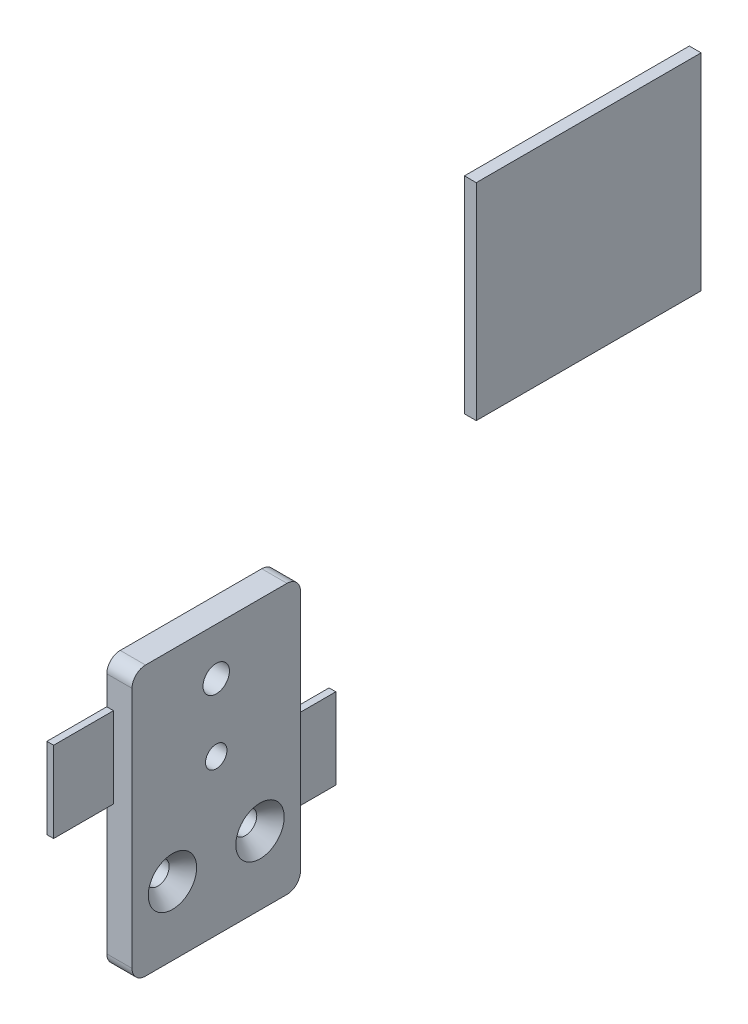
ISO-10303-21;
HEADER;
FILE_DESCRIPTION(('STEP AP214'),'2;1');
FILE_NAME('part.step','',(''),(''),'','','');
FILE_SCHEMA(('AUTOMOTIVE_DESIGN { 1 0 10303 214 1 1 1 1 }'));
ENDSEC;
DATA;
#1=APPLICATION_CONTEXT('core data for automotive mechanical design processes');
#2=APPLICATION_PROTOCOL_DEFINITION('international standard','automotive_design',2000,#1);
#3=PRODUCT_CONTEXT('',#1,'mechanical');
#4=PRODUCT('Part','Part','',(#3));
#5=PRODUCT_RELATED_PRODUCT_CATEGORY('part','',(#4));
#6=PRODUCT_DEFINITION_FORMATION('','',#4);
#7=PRODUCT_DEFINITION_CONTEXT('part definition',#1,'design');
#8=PRODUCT_DEFINITION('design','',#6,#7);
#9=PRODUCT_DEFINITION_SHAPE('','',#8);
#10=(LENGTH_UNIT() NAMED_UNIT(*) SI_UNIT(.MILLI.,.METRE.));
#11=(NAMED_UNIT(*) PLANE_ANGLE_UNIT() SI_UNIT($,.RADIAN.));
#12=(NAMED_UNIT(*) SI_UNIT($,.STERADIAN.) SOLID_ANGLE_UNIT());
#13=UNCERTAINTY_MEASURE_WITH_UNIT(LENGTH_MEASURE(1.E-05),#10,'distance_accuracy_value','');
#14=(GEOMETRIC_REPRESENTATION_CONTEXT(3) GLOBAL_UNCERTAINTY_ASSIGNED_CONTEXT((#13)) GLOBAL_UNIT_ASSIGNED_CONTEXT((#10,
#11,#12)) REPRESENTATION_CONTEXT('',''));
#15=CARTESIAN_POINT('',(0.,0.,0.));
#16=DIRECTION('',(0.,0.,1.));
#17=DIRECTION('',(1.,0.,0.));
#18=AXIS2_PLACEMENT_3D('',#15,#16,#17);
#19=CARTESIAN_POINT('',(2.54,0.,0.));
#20=DIRECTION('',(-1.,0.,0.));
#21=DIRECTION('',(0.,0.,1.));
#22=AXIS2_PLACEMENT_3D('',#19,#20,#21);
#23=PLANE('',#22);
#24=DIRECTION('',(0.,-1.,0.));
#25=VECTOR('',#24,1.);
#26=CARTESIAN_POINT('',(2.54,72.9724571619236,-49.0162949771469));
#27=LINE('',#26,#25);
#28=CARTESIAN_POINT('',(2.54,72.9724571619236,-49.0162949771469));
#29=VERTEX_POINT('',#28);
#30=CARTESIAN_POINT('',(2.54,34.112691774636,-49.0162949771469));
#31=VERTEX_POINT('',#30);
#32=EDGE_CURVE('E56',#29,#31,#27,.T.);
#33=ORIENTED_EDGE('',*,*,#32,.F.);
#34=DIRECTION('',(0.,0.,1.));
#35=VECTOR('',#34,1.);
#36=CARTESIAN_POINT('',(2.54,72.9724571619236,-49.0162949771469));
#37=LINE('',#36,#35);
#38=CARTESIAN_POINT('',(2.54,72.9724571619236,-91.4087663087333));
#39=VERTEX_POINT('',#38);
#40=EDGE_CURVE('E79',#39,#29,#37,.T.);
#41=ORIENTED_EDGE('',*,*,#40,.F.);
#42=DIRECTION('',(0.,1.,0.));
#43=VECTOR('',#42,1.);
#44=CARTESIAN_POINT('',(2.54,72.9724571619236,-91.4087663087333));
#45=LINE('',#44,#43);
#46=CARTESIAN_POINT('',(2.54,34.112691774636,-91.4087663087333));
#47=VERTEX_POINT('',#46);
#48=EDGE_CURVE('E84',#47,#39,#45,.T.);
#49=ORIENTED_EDGE('',*,*,#48,.F.);
#50=DIRECTION('',(0.,0.,-1.));
#51=VECTOR('',#50,1.);
#52=CARTESIAN_POINT('',(2.54,34.112691774636,-49.0162949771469));
#53=LINE('',#52,#51);
#54=EDGE_CURVE('E99',#31,#47,#53,.T.);
#55=ORIENTED_EDGE('',*,*,#54,.F.);
#56=EDGE_LOOP('',(#33,#41,#49,#55));
#57=FACE_BOUND('',#56,.T.);
#58=ADVANCED_FACE('F48',(#57),#23,.T.);
#59=CARTESIAN_POINT('',(4.7625,0.,0.));
#60=DIRECTION('',(1.,0.,0.));
#61=DIRECTION('',(0.,0.,-1.));
#62=AXIS2_PLACEMENT_3D('',#59,#60,#61);
#63=PLANE('',#62);
#64=DIRECTION('',(0.,-1.,0.));
#65=VECTOR('',#64,1.);
#66=CARTESIAN_POINT('',(4.7625,72.9724571619236,-49.0162949771469));
#67=LINE('',#66,#65);
#68=CARTESIAN_POINT('',(4.7625,72.9724571619236,-49.0162949771469));
#69=VERTEX_POINT('',#68);
#70=CARTESIAN_POINT('',(4.7625,34.112691774636,-49.0162949771469));
#71=VERTEX_POINT('',#70);
#72=EDGE_CURVE('E108',#69,#71,#67,.T.);
#73=ORIENTED_EDGE('',*,*,#72,.T.);
#74=DIRECTION('',(0.,0.,-1.));
#75=VECTOR('',#74,1.);
#76=CARTESIAN_POINT('',(4.7625,34.112691774636,-49.0162949771469));
#77=LINE('',#76,#75);
#78=CARTESIAN_POINT('',(4.7625,34.112691774636,-91.4087663087333));
#79=VERTEX_POINT('',#78);
#80=EDGE_CURVE('E97',#71,#79,#77,.T.);
#81=ORIENTED_EDGE('',*,*,#80,.T.);
#82=DIRECTION('',(0.,1.,0.));
#83=VECTOR('',#82,1.);
#84=CARTESIAN_POINT('',(4.7625,72.9724571619236,-91.4087663087333));
#85=LINE('',#84,#83);
#86=CARTESIAN_POINT('',(4.7625,72.9724571619236,-91.4087663087333));
#87=VERTEX_POINT('',#86);
#88=EDGE_CURVE('E100',#79,#87,#85,.T.);
#89=ORIENTED_EDGE('',*,*,#88,.T.);
#90=DIRECTION('',(0.,0.,1.));
#91=VECTOR('',#90,1.);
#92=CARTESIAN_POINT('',(4.7625,72.9724571619236,-49.0162949771469));
#93=LINE('',#92,#91);
#94=EDGE_CURVE('E105',#87,#69,#93,.T.);
#95=ORIENTED_EDGE('',*,*,#94,.T.);
#96=EDGE_LOOP('',(#73,#81,#89,#95));
#97=FACE_BOUND('',#96,.T.);
#98=ADVANCED_FACE('F107',(#97),#63,.T.);
#99=CARTESIAN_POINT('',(-57.5082862860164,34.112691774636,-49.0162949771469));
#100=DIRECTION('',(0.,-1.,0.));
#101=DIRECTION('',(0.,0.,-1.));
#102=AXIS2_PLACEMENT_3D('',#99,#100,#101);
#103=PLANE('',#102);
#104=DIRECTION('',(1.,0.,0.));
#105=VECTOR('',#104,1.);
#106=CARTESIAN_POINT('',(-57.5082862860164,34.112691774636,-49.0162949771469));
#107=LINE('',#106,#105);
#108=EDGE_CURVE('E12',#31,#71,#107,.T.);
#109=ORIENTED_EDGE('',*,*,#108,.F.);
#110=ORIENTED_EDGE('',*,*,#54,.T.);
#111=DIRECTION('',(1.,0.,0.));
#112=VECTOR('',#111,1.);
#113=CARTESIAN_POINT('',(-57.5082862860164,34.112691774636,-91.4087663087333));
#114=LINE('',#113,#112);
#115=EDGE_CURVE('E94',#47,#79,#114,.T.);
#116=ORIENTED_EDGE('',*,*,#115,.T.);
#117=ORIENTED_EDGE('',*,*,#80,.F.);
#118=EDGE_LOOP('',(#109,#110,#116,#117));
#119=FACE_BOUND('',#118,.T.);
#120=ADVANCED_FACE('F95',(#119),#103,.T.);
#121=CARTESIAN_POINT('',(-57.5082862860164,72.9724571619236,-91.4087663087333));
#122=DIRECTION('',(0.,0.,-1.));
#123=DIRECTION('',(-1.,0.,0.));
#124=AXIS2_PLACEMENT_3D('',#121,#122,#123);
#125=PLANE('',#124);
#126=ORIENTED_EDGE('',*,*,#115,.F.);
#127=ORIENTED_EDGE('',*,*,#48,.T.);
#128=DIRECTION('',(1.,0.,0.));
#129=VECTOR('',#128,1.);
#130=CARTESIAN_POINT('',(-57.5082862860164,72.9724571619236,-91.4087663087333));
#131=LINE('',#130,#129);
#132=EDGE_CURVE('E89',#39,#87,#131,.T.);
#133=ORIENTED_EDGE('',*,*,#132,.T.);
#134=ORIENTED_EDGE('',*,*,#88,.F.);
#135=EDGE_LOOP('',(#126,#127,#133,#134));
#136=FACE_BOUND('',#135,.T.);
#137=ADVANCED_FACE('F101',(#136),#125,.T.);
#138=CARTESIAN_POINT('',(-57.5082862860164,72.9724571619236,-49.0162949771469));
#139=DIRECTION('',(0.,1.,0.));
#140=DIRECTION('',(0.,0.,1.));
#141=AXIS2_PLACEMENT_3D('',#138,#139,#140);
#142=PLANE('',#141);
#143=ORIENTED_EDGE('',*,*,#132,.F.);
#144=ORIENTED_EDGE('',*,*,#40,.T.);
#145=DIRECTION('',(1.,0.,0.));
#146=VECTOR('',#145,1.);
#147=CARTESIAN_POINT('',(-57.5082862860164,72.9724571619236,-49.0162949771469));
#148=LINE('',#147,#146);
#149=EDGE_CURVE('E115',#29,#69,#148,.T.);
#150=ORIENTED_EDGE('',*,*,#149,.T.);
#151=ORIENTED_EDGE('',*,*,#94,.F.);
#152=EDGE_LOOP('',(#143,#144,#150,#151));
#153=FACE_BOUND('',#152,.T.);
#154=ADVANCED_FACE('F121',(#153),#142,.T.);
#155=CARTESIAN_POINT('',(-57.5082862860164,72.9724571619236,-49.0162949771469));
#156=DIRECTION('',(0.,0.,1.));
#157=DIRECTION('',(1.,0.,0.));
#158=AXIS2_PLACEMENT_3D('',#155,#156,#157);
#159=PLANE('',#158);
#160=ORIENTED_EDGE('',*,*,#149,.F.);
#161=ORIENTED_EDGE('',*,*,#32,.T.);
#162=ORIENTED_EDGE('',*,*,#108,.T.);
#163=ORIENTED_EDGE('',*,*,#72,.F.);
#164=EDGE_LOOP('',(#160,#161,#162,#163));
#165=FACE_BOUND('',#164,.T.);
#166=ADVANCED_FACE('F122',(#165),#159,.T.);
#167=CLOSED_SHELL('',(#58,#98,#120,#137,#154,#166));
#168=MANIFOLD_SOLID_BREP('B2',#167);
#169=CARTESIAN_POINT('',(4.7625,-25.4,-15.875));
#170=DIRECTION('',(0.,0.,1.));
#171=DIRECTION('',(0.,-1.,0.));
#172=AXIS2_PLACEMENT_3D('',#169,#170,#171);
#173=PLANE('',#172);
#174=DIRECTION('',(0.,1.,0.));
#175=VECTOR('',#174,1.);
#176=CARTESIAN_POINT('',(0.,-25.4,-15.875));
#177=LINE('',#176,#175);
#178=CARTESIAN_POINT('',(0.,-22.86,-15.875));
#179=VERTEX_POINT('',#178);
#180=CARTESIAN_POINT('',(0.,-15.6404812704776,-15.875));
#181=VERTEX_POINT('',#180);
#182=EDGE_CURVE('E318',#179,#181,#177,.T.);
#183=ORIENTED_EDGE('',*,*,#182,.T.);
#184=DIRECTION('',(-1.,0.,0.));
#185=VECTOR('',#184,1.);
#186=CARTESIAN_POINT('',(1.27,-15.6404812704776,-15.875));
#187=LINE('',#186,#185);
#188=CARTESIAN_POINT('',(1.27,-15.6404812704776,-15.875));
#189=VERTEX_POINT('',#188);
#190=EDGE_CURVE('E194',#189,#181,#187,.T.);
#191=ORIENTED_EDGE('',*,*,#190,.F.);
#192=DIRECTION('',(0.,1.,0.));
#193=VECTOR('',#192,1.);
#194=CARTESIAN_POINT('',(1.27,-0.400481270477608,-15.875));
#195=LINE('',#194,#193);
#196=CARTESIAN_POINT('',(1.27,-0.40048127047761,-15.875));
#197=VERTEX_POINT('',#196);
#198=EDGE_CURVE('E189',#189,#197,#195,.T.);
#199=ORIENTED_EDGE('',*,*,#198,.T.);
#200=DIRECTION('',(-1.,0.,0.));
#201=VECTOR('',#200,1.);
#202=CARTESIAN_POINT('',(1.27,-0.400481270477608,-15.875));
#203=LINE('',#202,#201);
#204=CARTESIAN_POINT('',(0.,-0.400481270477608,-15.875));
#205=VERTEX_POINT('',#204);
#206=EDGE_CURVE('E297',#197,#205,#203,.T.);
#207=ORIENTED_EDGE('',*,*,#206,.T.);
#208=CARTESIAN_POINT('',(0.,22.86,-15.875));
#209=VERTEX_POINT('',#208);
#210=EDGE_CURVE('E322',#205,#209,#177,.T.);
#211=ORIENTED_EDGE('',*,*,#210,.T.);
#212=DIRECTION('',(-1.,0.,0.));
#213=VECTOR('',#212,1.);
#214=CARTESIAN_POINT('',(4.7625,22.86,-15.875));
#215=LINE('',#214,#213);
#216=CARTESIAN_POINT('',(4.7625,22.86,-15.875));
#217=VERTEX_POINT('',#216);
#218=EDGE_CURVE('E353',#209,#217,#215,.F.);
#219=ORIENTED_EDGE('',*,*,#218,.T.);
#220=DIRECTION('',(0.,1.,0.));
#221=VECTOR('',#220,1.);
#222=CARTESIAN_POINT('',(4.7625,-25.4,-15.875));
#223=LINE('',#222,#221);
#224=CARTESIAN_POINT('',(4.7625,-22.86,-15.875));
#225=VERTEX_POINT('',#224);
#226=EDGE_CURVE('E334',#225,#217,#223,.T.);
#227=ORIENTED_EDGE('',*,*,#226,.F.);
#228=DIRECTION('',(-1.,0.,0.));
#229=VECTOR('',#228,1.);
#230=CARTESIAN_POINT('',(4.7625,-22.86,-15.875));
#231=LINE('',#230,#229);
#232=EDGE_CURVE('E350',#225,#179,#231,.T.);
#233=ORIENTED_EDGE('',*,*,#232,.T.);
#234=EDGE_LOOP('',(#183,#191,#199,#207,#211,#219,#227,#233));
#235=FACE_BOUND('',#234,.T.);
#236=ADVANCED_FACE('F174',(#235),#173,.F.);
#237=CARTESIAN_POINT('',(4.7625,25.4,15.875));
#238=DIRECTION('',(0.,-1.,0.));
#239=DIRECTION('',(0.,0.,-1.));
#240=AXIS2_PLACEMENT_3D('',#237,#238,#239);
#241=PLANE('',#240);
#242=DIRECTION('',(0.,0.,1.));
#243=VECTOR('',#242,1.);
#244=CARTESIAN_POINT('',(4.7625,25.4,15.875));
#245=LINE('',#244,#243);
#246=CARTESIAN_POINT('',(4.7625,25.4,-13.335));
#247=VERTEX_POINT('',#246);
#248=CARTESIAN_POINT('',(4.7625,25.4,13.335));
#249=VERTEX_POINT('',#248);
#250=EDGE_CURVE('E445',#247,#249,#245,.T.);
#251=ORIENTED_EDGE('',*,*,#250,.F.);
#252=DIRECTION('',(-1.,0.,0.));
#253=VECTOR('',#252,1.);
#254=CARTESIAN_POINT('',(4.7625,25.4,-13.335));
#255=LINE('',#254,#253);
#256=CARTESIAN_POINT('',(0.,25.4,-13.335));
#257=VERTEX_POINT('',#256);
#258=EDGE_CURVE('E337',#247,#257,#255,.T.);
#259=ORIENTED_EDGE('',*,*,#258,.T.);
#260=DIRECTION('',(0.,0.,1.));
#261=VECTOR('',#260,1.);
#262=CARTESIAN_POINT('',(0.,25.4,15.875));
#263=LINE('',#262,#261);
#264=CARTESIAN_POINT('',(0.,25.4,13.335));
#265=VERTEX_POINT('',#264);
#266=EDGE_CURVE('E321',#257,#265,#263,.T.);
#267=ORIENTED_EDGE('',*,*,#266,.T.);
#268=DIRECTION('',(-1.,0.,0.));
#269=VECTOR('',#268,1.);
#270=CARTESIAN_POINT('',(4.7625,25.4,13.335));
#271=LINE('',#270,#269);
#272=EDGE_CURVE('E335',#265,#249,#271,.F.);
#273=ORIENTED_EDGE('',*,*,#272,.T.);
#274=EDGE_LOOP('',(#251,#259,#267,#273));
#275=FACE_BOUND('',#274,.T.);
#276=ADVANCED_FACE('F459',(#275),#241,.F.);
#277=CARTESIAN_POINT('',(4.7625,-25.4,15.875));
#278=DIRECTION('',(0.,0.,-1.));
#279=DIRECTION('',(0.,1.,0.));
#280=AXIS2_PLACEMENT_3D('',#277,#278,#279);
#281=PLANE('',#280);
#282=DIRECTION('',(0.,-1.,0.));
#283=VECTOR('',#282,1.);
#284=CARTESIAN_POINT('',(0.,-25.4,15.875));
#285=LINE('',#284,#283);
#286=CARTESIAN_POINT('',(0.,22.86,15.875));
#287=VERTEX_POINT('',#286);
#288=CARTESIAN_POINT('',(0.,17.4719887939091,15.875));
#289=VERTEX_POINT('',#288);
#290=EDGE_CURVE('E329',#287,#289,#285,.T.);
#291=ORIENTED_EDGE('',*,*,#290,.T.);
#292=DIRECTION('',(-1.,0.,0.));
#293=VECTOR('',#292,1.);
#294=CARTESIAN_POINT('',(1.27,17.4719887939091,15.875));
#295=LINE('',#294,#293);
#296=CARTESIAN_POINT('',(1.27,17.4719887939091,15.875));
#297=VERTEX_POINT('',#296);
#298=EDGE_CURVE('E397',#297,#289,#295,.T.);
#299=ORIENTED_EDGE('',*,*,#298,.F.);
#300=DIRECTION('',(0.,-1.,0.));
#301=VECTOR('',#300,1.);
#302=CARTESIAN_POINT('',(1.27,17.4719887939091,15.875));
#303=LINE('',#302,#301);
#304=CARTESIAN_POINT('',(1.27,2.23198879390913,15.875));
#305=VERTEX_POINT('',#304);
#306=EDGE_CURVE('E389',#297,#305,#303,.T.);
#307=ORIENTED_EDGE('',*,*,#306,.T.);
#308=DIRECTION('',(-1.,0.,0.));
#309=VECTOR('',#308,1.);
#310=CARTESIAN_POINT('',(1.27,2.23198879390913,15.875));
#311=LINE('',#310,#309);
#312=CARTESIAN_POINT('',(0.,2.23198879390913,15.875));
#313=VERTEX_POINT('',#312);
#314=EDGE_CURVE('E404',#305,#313,#311,.T.);
#315=ORIENTED_EDGE('',*,*,#314,.T.);
#316=CARTESIAN_POINT('',(0.,-22.86,15.875));
#317=VERTEX_POINT('',#316);
#318=EDGE_CURVE('E328',#313,#317,#285,.T.);
#319=ORIENTED_EDGE('',*,*,#318,.T.);
#320=DIRECTION('',(-1.,0.,0.));
#321=VECTOR('',#320,1.);
#322=CARTESIAN_POINT('',(4.7625,-22.86,15.875));
#323=LINE('',#322,#321);
#324=CARTESIAN_POINT('',(4.7625,-22.86,15.875));
#325=VERTEX_POINT('',#324);
#326=EDGE_CURVE('E46',#317,#325,#323,.F.);
#327=ORIENTED_EDGE('',*,*,#326,.T.);
#328=DIRECTION('',(0.,-1.,0.));
#329=VECTOR('',#328,1.);
#330=CARTESIAN_POINT('',(4.7625,-25.4,15.875));
#331=LINE('',#330,#329);
#332=CARTESIAN_POINT('',(4.7625,22.86,15.875));
#333=VERTEX_POINT('',#332);
#334=EDGE_CURVE('E375',#333,#325,#331,.T.);
#335=ORIENTED_EDGE('',*,*,#334,.F.);
#336=DIRECTION('',(-1.,0.,0.));
#337=VECTOR('',#336,1.);
#338=CARTESIAN_POINT('',(4.7625,22.86,15.875));
#339=LINE('',#338,#337);
#340=EDGE_CURVE('E182',#333,#287,#339,.T.);
#341=ORIENTED_EDGE('',*,*,#340,.T.);
#342=EDGE_LOOP('',(#291,#299,#307,#315,#319,#327,#335,#341));
#343=FACE_BOUND('',#342,.T.);
#344=ADVANCED_FACE('F372',(#343),#281,.F.);
#345=CARTESIAN_POINT('',(4.7625,-25.4,15.875));
#346=DIRECTION('',(0.,1.,0.));
#347=DIRECTION('',(0.,0.,1.));
#348=AXIS2_PLACEMENT_3D('',#345,#346,#347);
#349=PLANE('',#348);
#350=DIRECTION('',(0.,0.,-1.));
#351=VECTOR('',#350,1.);
#352=CARTESIAN_POINT('',(0.,-25.4,15.875));
#353=LINE('',#352,#351);
#354=CARTESIAN_POINT('',(0.,-25.4,13.335));
#355=VERTEX_POINT('',#354);
#356=CARTESIAN_POINT('',(0.,-25.4,-13.335));
#357=VERTEX_POINT('',#356);
#358=EDGE_CURVE('E331',#355,#357,#353,.T.);
#359=ORIENTED_EDGE('',*,*,#358,.T.);
#360=DIRECTION('',(-1.,0.,0.));
#361=VECTOR('',#360,1.);
#362=CARTESIAN_POINT('',(4.7625,-25.4,-13.335));
#363=LINE('',#362,#361);
#364=CARTESIAN_POINT('',(4.7625,-25.4,-13.335));
#365=VERTEX_POINT('',#364);
#366=EDGE_CURVE('E366',#357,#365,#363,.F.);
#367=ORIENTED_EDGE('',*,*,#366,.T.);
#368=DIRECTION('',(0.,0.,-1.));
#369=VECTOR('',#368,1.);
#370=CARTESIAN_POINT('',(4.7625,-25.4,15.875));
#371=LINE('',#370,#369);
#372=CARTESIAN_POINT('',(4.7625,-25.4,13.335));
#373=VERTEX_POINT('',#372);
#374=EDGE_CURVE('E323',#373,#365,#371,.T.);
#375=ORIENTED_EDGE('',*,*,#374,.F.);
#376=DIRECTION('',(-1.,0.,0.));
#377=VECTOR('',#376,1.);
#378=CARTESIAN_POINT('',(4.7625,-25.4,13.335));
#379=LINE('',#378,#377);
#380=EDGE_CURVE('E363',#373,#355,#379,.T.);
#381=ORIENTED_EDGE('',*,*,#380,.T.);
#382=EDGE_LOOP('',(#359,#367,#375,#381));
#383=FACE_BOUND('',#382,.T.);
#384=ADVANCED_FACE('F507',(#383),#349,.F.);
#385=CARTESIAN_POINT('',(4.7625,0.,0.));
#386=DIRECTION('',(-1.,0.,0.));
#387=DIRECTION('',(0.,0.,1.));
#388=AXIS2_PLACEMENT_3D('',#385,#386,#387);
#389=PLANE('',#388);
#390=CARTESIAN_POINT('',(4.7625,3.81,0.));
#391=DIRECTION('',(1.,0.,0.));
#392=DIRECTION('',(0.,0.,-1.));
#393=AXIS2_PLACEMENT_3D('',#390,#391,#392);
#394=CIRCLE('',#393,2.0193);
#395=CARTESIAN_POINT('',(4.7625,3.81,-2.0193));
#396=VERTEX_POINT('',#395);
#397=EDGE_CURVE('E399',#396,#396,#394,.T.);
#398=ORIENTED_EDGE('',*,*,#397,.F.);
#399=EDGE_LOOP('',(#398));
#400=FACE_BOUND('',#399,.T.);
#401=CARTESIAN_POINT('',(4.7625,16.51,0.));
#402=DIRECTION('',(1.,0.,0.));
#403=DIRECTION('',(0.,0.,-1.));
#404=AXIS2_PLACEMENT_3D('',#401,#402,#403);
#405=CIRCLE('',#404,2.4892);
#406=CARTESIAN_POINT('',(4.7625,16.51,-2.4892));
#407=VERTEX_POINT('',#406);
#408=EDGE_CURVE('E413',#407,#407,#405,.T.);
#409=ORIENTED_EDGE('',*,*,#408,.F.);
#410=EDGE_LOOP('',(#409));
#411=FACE_BOUND('',#410,.T.);
#412=CARTESIAN_POINT('',(4.7625,-12.4841,8.25500000000001));
#413=DIRECTION('',(1.,0.,0.));
#414=DIRECTION('',(0.,0.,-1.));
#415=AXIS2_PLACEMENT_3D('',#412,#413,#414);
#416=CIRCLE('',#415,4.5593);
#417=CARTESIAN_POINT('',(4.7625,-12.4841,3.69570000000001));
#418=VERTEX_POINT('',#417);
#419=EDGE_CURVE('E423',#418,#418,#416,.T.);
#420=ORIENTED_EDGE('',*,*,#419,.F.);
#421=EDGE_LOOP('',(#420));
#422=FACE_BOUND('',#421,.T.);
#423=CARTESIAN_POINT('',(4.7625,-12.4841,-8.25500000000001));
#424=DIRECTION('',(1.,0.,0.));
#425=DIRECTION('',(0.,0.,-1.));
#426=AXIS2_PLACEMENT_3D('',#423,#424,#425);
#427=CIRCLE('',#426,4.5593);
#428=CARTESIAN_POINT('',(4.7625,-12.4841,-12.8143));
#429=VERTEX_POINT('',#428);
#430=EDGE_CURVE('E432',#429,#429,#427,.T.);
#431=ORIENTED_EDGE('',*,*,#430,.F.);
#432=EDGE_LOOP('',(#431));
#433=FACE_BOUND('',#432,.T.);
#434=ORIENTED_EDGE('',*,*,#226,.T.);
#435=CARTESIAN_POINT('',(4.7625,22.86,-13.335));
#436=DIRECTION('',(-1.,0.,0.));
#437=DIRECTION('',(0.,0.,1.));
#438=AXIS2_PLACEMENT_3D('',#435,#436,#437);
#439=CIRCLE('',#438,2.54);
#440=EDGE_CURVE('E361',#217,#247,#439,.F.);
#441=ORIENTED_EDGE('',*,*,#440,.T.);
#442=ORIENTED_EDGE('',*,*,#250,.T.);
#443=CARTESIAN_POINT('',(4.7625,22.86,13.335));
#444=DIRECTION('',(-1.,0.,0.));
#445=DIRECTION('',(0.,0.,1.));
#446=AXIS2_PLACEMENT_3D('',#443,#444,#445);
#447=CIRCLE('',#446,2.54);
#448=EDGE_CURVE('E355',#249,#333,#447,.F.);
#449=ORIENTED_EDGE('',*,*,#448,.T.);
#450=ORIENTED_EDGE('',*,*,#334,.T.);
#451=CARTESIAN_POINT('',(4.7625,-22.86,13.335));
#452=DIRECTION('',(-1.,0.,0.));
#453=DIRECTION('',(0.,0.,1.));
#454=AXIS2_PLACEMENT_3D('',#451,#452,#453);
#455=CIRCLE('',#454,2.54);
#456=EDGE_CURVE('E357',#325,#373,#455,.F.);
#457=ORIENTED_EDGE('',*,*,#456,.T.);
#458=ORIENTED_EDGE('',*,*,#374,.T.);
#459=CARTESIAN_POINT('',(4.7625,-22.86,-13.335));
#460=DIRECTION('',(-1.,0.,0.));
#461=DIRECTION('',(0.,0.,1.));
#462=AXIS2_PLACEMENT_3D('',#459,#460,#461);
#463=CIRCLE('',#462,2.54);
#464=EDGE_CURVE('E359',#365,#225,#463,.F.);
#465=ORIENTED_EDGE('',*,*,#464,.T.);
#466=EDGE_LOOP('',(#434,#441,#442,#449,#450,#457,#458,#465));
#467=FACE_BOUND('',#466,.T.);
#468=ADVANCED_FACE('F454',(#400,#411,#422,#433,#467),#389,.F.);
#469=CARTESIAN_POINT('',(0.,0.,0.));
#470=DIRECTION('',(-1.,0.,0.));
#471=DIRECTION('',(0.,0.,1.));
#472=AXIS2_PLACEMENT_3D('',#469,#470,#471);
#473=PLANE('',#472);
#474=CARTESIAN_POINT('',(0.,3.81,0.));
#475=DIRECTION('',(1.,0.,0.));
#476=DIRECTION('',(0.,0.,-1.));
#477=AXIS2_PLACEMENT_3D('',#474,#475,#476);
#478=CIRCLE('',#477,2.0193);
#479=CARTESIAN_POINT('',(0.,3.81,-2.0193));
#480=VERTEX_POINT('',#479);
#481=EDGE_CURVE('E410',#480,#480,#478,.T.);
#482=ORIENTED_EDGE('',*,*,#481,.T.);
#483=EDGE_LOOP('',(#482));
#484=FACE_BOUND('',#483,.T.);
#485=CARTESIAN_POINT('',(0.,16.51,0.));
#486=DIRECTION('',(1.,0.,0.));
#487=DIRECTION('',(0.,0.,-1.));
#488=AXIS2_PLACEMENT_3D('',#485,#486,#487);
#489=CIRCLE('',#488,2.4892);
#490=CARTESIAN_POINT('',(0.,16.51,-2.4892));
#491=VERTEX_POINT('',#490);
#492=EDGE_CURVE('E417',#491,#491,#489,.T.);
#493=ORIENTED_EDGE('',*,*,#492,.T.);
#494=EDGE_LOOP('',(#493));
#495=FACE_BOUND('',#494,.T.);
#496=CARTESIAN_POINT('',(0.,-12.4841,8.25500000000001));
#497=DIRECTION('',(1.,0.,0.));
#498=DIRECTION('',(0.,0.,-1.));
#499=AXIS2_PLACEMENT_3D('',#496,#497,#498);
#500=CIRCLE('',#499,2.15264999999999);
#501=CARTESIAN_POINT('',(0.,-12.4841,6.10235000000002));
#502=VERTEX_POINT('',#501);
#503=EDGE_CURVE('E430',#502,#502,#500,.T.);
#504=ORIENTED_EDGE('',*,*,#503,.T.);
#505=EDGE_LOOP('',(#504));
#506=FACE_BOUND('',#505,.T.);
#507=CARTESIAN_POINT('',(0.,-12.4841,-8.25500000000001));
#508=DIRECTION('',(1.,0.,0.));
#509=DIRECTION('',(0.,0.,-1.));
#510=AXIS2_PLACEMENT_3D('',#507,#508,#509);
#511=CIRCLE('',#510,2.15264999999999);
#512=CARTESIAN_POINT('',(0.,-12.4841,-10.40765));
#513=VERTEX_POINT('',#512);
#514=EDGE_CURVE('E439',#513,#513,#511,.T.);
#515=ORIENTED_EDGE('',*,*,#514,.T.);
#516=EDGE_LOOP('',(#515));
#517=FACE_BOUND('',#516,.T.);
#518=ORIENTED_EDGE('',*,*,#266,.F.);
#519=CARTESIAN_POINT('',(0.,22.86,-13.335));
#520=DIRECTION('',(-1.,0.,0.));
#521=DIRECTION('',(0.,0.,1.));
#522=AXIS2_PLACEMENT_3D('',#519,#520,#521);
#523=CIRCLE('',#522,2.54);
#524=EDGE_CURVE('E347',#257,#209,#523,.T.);
#525=ORIENTED_EDGE('',*,*,#524,.T.);
#526=ORIENTED_EDGE('',*,*,#210,.F.);
#527=DIRECTION('',(0.,0.,-1.));
#528=VECTOR('',#527,1.);
#529=CARTESIAN_POINT('',(0.,-0.400481270477608,-15.875));
#530=LINE('',#529,#528);
#531=CARTESIAN_POINT('',(0.,-0.400481270477609,-26.0333352036231));
#532=VERTEX_POINT('',#531);
#533=EDGE_CURVE('E476',#205,#532,#530,.T.);
#534=ORIENTED_EDGE('',*,*,#533,.T.);
#535=DIRECTION('',(0.,-1.,0.));
#536=VECTOR('',#535,1.);
#537=CARTESIAN_POINT('',(0.,-0.400481270477609,-26.0333352036231));
#538=LINE('',#537,#536);
#539=CARTESIAN_POINT('',(0.,-15.6404812704776,-26.0333352036231));
#540=VERTEX_POINT('',#539);
#541=EDGE_CURVE('E291',#532,#540,#538,.T.);
#542=ORIENTED_EDGE('',*,*,#541,.T.);
#543=DIRECTION('',(0.,0.,1.));
#544=VECTOR('',#543,1.);
#545=CARTESIAN_POINT('',(0.,-15.6404812704776,-15.875));
#546=LINE('',#545,#544);
#547=EDGE_CURVE('E308',#540,#181,#546,.T.);
#548=ORIENTED_EDGE('',*,*,#547,.T.);
#549=ORIENTED_EDGE('',*,*,#182,.F.);
#550=CARTESIAN_POINT('',(0.,-22.86,-13.335));
#551=DIRECTION('',(-1.,0.,0.));
#552=DIRECTION('',(0.,0.,1.));
#553=AXIS2_PLACEMENT_3D('',#550,#551,#552);
#554=CIRCLE('',#553,2.54);
#555=EDGE_CURVE('E345',#179,#357,#554,.T.);
#556=ORIENTED_EDGE('',*,*,#555,.T.);
#557=ORIENTED_EDGE('',*,*,#358,.F.);
#558=CARTESIAN_POINT('',(0.,-22.86,13.335));
#559=DIRECTION('',(-1.,0.,0.));
#560=DIRECTION('',(0.,0.,1.));
#561=AXIS2_PLACEMENT_3D('',#558,#559,#560);
#562=CIRCLE('',#561,2.54);
#563=EDGE_CURVE('E342',#355,#317,#562,.T.);
#564=ORIENTED_EDGE('',*,*,#563,.T.);
#565=ORIENTED_EDGE('',*,*,#318,.F.);
#566=DIRECTION('',(0.,0.,1.));
#567=VECTOR('',#566,1.);
#568=CARTESIAN_POINT('',(0.,2.23198879390913,15.875));
#569=LINE('',#568,#567);
#570=CARTESIAN_POINT('',(0.,2.23198879390913,27.1653779628842));
#571=VERTEX_POINT('',#570);
#572=EDGE_CURVE('E393',#313,#571,#569,.T.);
#573=ORIENTED_EDGE('',*,*,#572,.T.);
#574=DIRECTION('',(0.,1.,0.));
#575=VECTOR('',#574,1.);
#576=CARTESIAN_POINT('',(0.,17.4719887939091,27.1653779628842));
#577=LINE('',#576,#575);
#578=CARTESIAN_POINT('',(0.,17.4719887939091,27.1653779628842));
#579=VERTEX_POINT('',#578);
#580=EDGE_CURVE('E387',#571,#579,#577,.T.);
#581=ORIENTED_EDGE('',*,*,#580,.T.);
#582=DIRECTION('',(0.,0.,-1.));
#583=VECTOR('',#582,1.);
#584=CARTESIAN_POINT('',(0.,17.4719887939091,15.875));
#585=LINE('',#584,#583);
#586=EDGE_CURVE('E384',#579,#289,#585,.T.);
#587=ORIENTED_EDGE('',*,*,#586,.T.);
#588=ORIENTED_EDGE('',*,*,#290,.F.);
#589=CARTESIAN_POINT('',(0.,22.86,13.335));
#590=DIRECTION('',(-1.,0.,0.));
#591=DIRECTION('',(0.,0.,1.));
#592=AXIS2_PLACEMENT_3D('',#589,#590,#591);
#593=CIRCLE('',#592,2.54);
#594=EDGE_CURVE('E340',#287,#265,#593,.T.);
#595=ORIENTED_EDGE('',*,*,#594,.T.);
#596=EDGE_LOOP('',(#518,#525,#526,#534,#542,#548,#549,#556,#557,#564,#565,#573,#581,#587,#588,#595));
#597=FACE_BOUND('',#596,.T.);
#598=ADVANCED_FACE('F381',(#484,#495,#506,#517,#597),#473,.T.);
#599=CARTESIAN_POINT('',(4.7625,-12.4841,-8.25500000000001));
#600=DIRECTION('',(1.,0.,0.));
#601=DIRECTION('',(0.,0.,-1.));
#602=AXIS2_PLACEMENT_3D('',#599,#600,#601);
#603=CYLINDRICAL_SURFACE('',#602,2.15264999999999);
#604=ORIENTED_EDGE('',*,*,#514,.F.);
#605=EDGE_LOOP('',(#604));
#606=FACE_BOUND('',#605,.T.);
#607=CARTESIAN_POINT('',(1.99396587276154,-12.4841,-8.25500000000001));
#608=DIRECTION('',(1.,0.,0.));
#609=DIRECTION('',(0.,0.,-1.));
#610=AXIS2_PLACEMENT_3D('',#607,#608,#609);
#611=CIRCLE('',#610,2.15264999999999);
#612=CARTESIAN_POINT('',(1.99396587276154,-12.4841,-10.40765));
#613=VERTEX_POINT('',#612);
#614=EDGE_CURVE('E436',#613,#613,#611,.T.);
#615=ORIENTED_EDGE('',*,*,#614,.T.);
#616=EDGE_LOOP('',(#615));
#617=FACE_BOUND('',#616,.T.);
#618=ADVANCED_FACE('F565',(#606,#617),#603,.F.);
#619=CARTESIAN_POINT('',(4.7625,-12.4841,-8.25500000000001));
#620=DIRECTION('',(1.,0.,0.));
#621=DIRECTION('',(0.,0.,-1.));
#622=AXIS2_PLACEMENT_3D('',#619,#620,#621);
#623=CONICAL_SURFACE('',#622,4.5593,0.715584993317674);
#624=ORIENTED_EDGE('',*,*,#614,.F.);
#625=EDGE_LOOP('',(#624));
#626=FACE_BOUND('',#625,.T.);
#627=ORIENTED_EDGE('',*,*,#430,.T.);
#628=EDGE_LOOP('',(#627));
#629=FACE_BOUND('',#628,.T.);
#630=ADVANCED_FACE('F561',(#626,#629),#623,.F.);
#631=CARTESIAN_POINT('',(4.7625,-12.4841,8.25500000000001));
#632=DIRECTION('',(1.,0.,0.));
#633=DIRECTION('',(0.,0.,-1.));
#634=AXIS2_PLACEMENT_3D('',#631,#632,#633);
#635=CYLINDRICAL_SURFACE('',#634,2.15264999999999);
#636=ORIENTED_EDGE('',*,*,#503,.F.);
#637=EDGE_LOOP('',(#636));
#638=FACE_BOUND('',#637,.T.);
#639=CARTESIAN_POINT('',(1.99396587276154,-12.4841,8.25500000000001));
#640=DIRECTION('',(1.,0.,0.));
#641=DIRECTION('',(0.,0.,-1.));
#642=AXIS2_PLACEMENT_3D('',#639,#640,#641);
#643=CIRCLE('',#642,2.15264999999999);
#644=CARTESIAN_POINT('',(1.99396587276154,-12.4841,6.10235000000002));
#645=VERTEX_POINT('',#644);
#646=EDGE_CURVE('E427',#645,#645,#643,.T.);
#647=ORIENTED_EDGE('',*,*,#646,.T.);
#648=EDGE_LOOP('',(#647));
#649=FACE_BOUND('',#648,.T.);
#650=ADVANCED_FACE('F557',(#638,#649),#635,.F.);
#651=CARTESIAN_POINT('',(4.7625,-12.4841,8.25500000000001));
#652=DIRECTION('',(1.,0.,0.));
#653=DIRECTION('',(0.,0.,-1.));
#654=AXIS2_PLACEMENT_3D('',#651,#652,#653);
#655=CONICAL_SURFACE('',#654,4.5593,0.715584993317674);
#656=ORIENTED_EDGE('',*,*,#646,.F.);
#657=EDGE_LOOP('',(#656));
#658=FACE_BOUND('',#657,.T.);
#659=ORIENTED_EDGE('',*,*,#419,.T.);
#660=EDGE_LOOP('',(#659));
#661=FACE_BOUND('',#660,.T.);
#662=ADVANCED_FACE('F553',(#658,#661),#655,.F.);
#663=CARTESIAN_POINT('',(4.7625,16.51,0.));
#664=DIRECTION('',(1.,0.,0.));
#665=DIRECTION('',(0.,0.,-1.));
#666=AXIS2_PLACEMENT_3D('',#663,#664,#665);
#667=CYLINDRICAL_SURFACE('',#666,2.4892);
#668=ORIENTED_EDGE('',*,*,#492,.F.);
#669=EDGE_LOOP('',(#668));
#670=FACE_BOUND('',#669,.T.);
#671=ORIENTED_EDGE('',*,*,#408,.T.);
#672=EDGE_LOOP('',(#671));
#673=FACE_BOUND('',#672,.T.);
#674=ADVANCED_FACE('F529',(#670,#673),#667,.F.);
#675=CARTESIAN_POINT('',(4.7625,22.86,-13.335));
#676=DIRECTION('',(-1.,0.,0.));
#677=DIRECTION('',(0.,0.,1.));
#678=AXIS2_PLACEMENT_3D('',#675,#676,#677);
#679=CYLINDRICAL_SURFACE('',#678,2.54);
#680=ORIENTED_EDGE('',*,*,#440,.F.);
#681=ORIENTED_EDGE('',*,*,#218,.F.);
#682=ORIENTED_EDGE('',*,*,#524,.F.);
#683=ORIENTED_EDGE('',*,*,#258,.F.);
#684=EDGE_LOOP('',(#680,#681,#682,#683));
#685=FACE_BOUND('',#684,.T.);
#686=ADVANCED_FACE('F462',(#685),#679,.T.);
#687=CARTESIAN_POINT('',(4.7625,-22.86,-13.335));
#688=DIRECTION('',(-1.,0.,0.));
#689=DIRECTION('',(0.,0.,1.));
#690=AXIS2_PLACEMENT_3D('',#687,#688,#689);
#691=CYLINDRICAL_SURFACE('',#690,2.54);
#692=ORIENTED_EDGE('',*,*,#464,.F.);
#693=ORIENTED_EDGE('',*,*,#366,.F.);
#694=ORIENTED_EDGE('',*,*,#555,.F.);
#695=ORIENTED_EDGE('',*,*,#232,.F.);
#696=EDGE_LOOP('',(#692,#693,#694,#695));
#697=FACE_BOUND('',#696,.T.);
#698=ADVANCED_FACE('F469',(#697),#691,.T.);
#699=CARTESIAN_POINT('',(4.7625,-22.86,13.335));
#700=DIRECTION('',(-1.,0.,0.));
#701=DIRECTION('',(0.,0.,1.));
#702=AXIS2_PLACEMENT_3D('',#699,#700,#701);
#703=CYLINDRICAL_SURFACE('',#702,2.54);
#704=ORIENTED_EDGE('',*,*,#456,.F.);
#705=ORIENTED_EDGE('',*,*,#326,.F.);
#706=ORIENTED_EDGE('',*,*,#563,.F.);
#707=ORIENTED_EDGE('',*,*,#380,.F.);
#708=EDGE_LOOP('',(#704,#705,#706,#707));
#709=FACE_BOUND('',#708,.T.);
#710=ADVANCED_FACE('F505',(#709),#703,.T.);
#711=CARTESIAN_POINT('',(4.7625,22.86,13.335));
#712=DIRECTION('',(-1.,0.,0.));
#713=DIRECTION('',(0.,0.,1.));
#714=AXIS2_PLACEMENT_3D('',#711,#712,#713);
#715=CYLINDRICAL_SURFACE('',#714,2.54);
#716=ORIENTED_EDGE('',*,*,#448,.F.);
#717=ORIENTED_EDGE('',*,*,#272,.F.);
#718=ORIENTED_EDGE('',*,*,#594,.F.);
#719=ORIENTED_EDGE('',*,*,#340,.F.);
#720=EDGE_LOOP('',(#716,#717,#718,#719));
#721=FACE_BOUND('',#720,.T.);
#722=ADVANCED_FACE('F176',(#721),#715,.T.);
#723=CARTESIAN_POINT('',(4.7625,3.81,0.));
#724=DIRECTION('',(1.,0.,0.));
#725=DIRECTION('',(0.,0.,-1.));
#726=AXIS2_PLACEMENT_3D('',#723,#724,#725);
#727=CYLINDRICAL_SURFACE('',#726,2.0193);
#728=ORIENTED_EDGE('',*,*,#481,.F.);
#729=EDGE_LOOP('',(#728));
#730=FACE_BOUND('',#729,.T.);
#731=ORIENTED_EDGE('',*,*,#397,.T.);
#732=EDGE_LOOP('',(#731));
#733=FACE_BOUND('',#732,.T.);
#734=ADVANCED_FACE('F535',(#730,#733),#727,.F.);
#735=CARTESIAN_POINT('',(1.27,17.4719887939091,15.875));
#736=DIRECTION('',(0.,1.,0.));
#737=DIRECTION('',(0.,0.,1.));
#738=AXIS2_PLACEMENT_3D('',#735,#736,#737);
#739=PLANE('',#738);
#740=ORIENTED_EDGE('',*,*,#586,.F.);
#741=DIRECTION('',(-1.,0.,0.));
#742=VECTOR('',#741,1.);
#743=CARTESIAN_POINT('',(1.27,17.4719887939091,27.1653779628842));
#744=LINE('',#743,#742);
#745=CARTESIAN_POINT('',(1.27,17.4719887939091,27.1653779628842));
#746=VERTEX_POINT('',#745);
#747=EDGE_CURVE('E400',#746,#579,#744,.T.);
#748=ORIENTED_EDGE('',*,*,#747,.F.);
#749=DIRECTION('',(0.,0.,-1.));
#750=VECTOR('',#749,1.);
#751=CARTESIAN_POINT('',(1.27,17.4719887939091,15.875));
#752=LINE('',#751,#750);
#753=EDGE_CURVE('E406',#746,#297,#752,.T.);
#754=ORIENTED_EDGE('',*,*,#753,.T.);
#755=ORIENTED_EDGE('',*,*,#298,.T.);
#756=EDGE_LOOP('',(#740,#748,#754,#755));
#757=FACE_BOUND('',#756,.T.);
#758=ADVANCED_FACE('F498',(#757),#739,.T.);
#759=CARTESIAN_POINT('',(1.27,17.4719887939091,27.1653779628842));
#760=DIRECTION('',(0.,0.,1.));
#761=DIRECTION('',(0.,-1.,0.));
#762=AXIS2_PLACEMENT_3D('',#759,#760,#761);
#763=PLANE('',#762);
#764=ORIENTED_EDGE('',*,*,#580,.F.);
#765=DIRECTION('',(-1.,0.,0.));
#766=VECTOR('',#765,1.);
#767=CARTESIAN_POINT('',(1.27,2.23198879390913,27.1653779628842));
#768=LINE('',#767,#766);
#769=CARTESIAN_POINT('',(1.27,2.23198879390913,27.1653779628842));
#770=VERTEX_POINT('',#769);
#771=EDGE_CURVE('E402',#770,#571,#768,.T.);
#772=ORIENTED_EDGE('',*,*,#771,.F.);
#773=DIRECTION('',(0.,1.,0.));
#774=VECTOR('',#773,1.);
#775=CARTESIAN_POINT('',(1.27,17.4719887939091,27.1653779628842));
#776=LINE('',#775,#774);
#777=EDGE_CURVE('E485',#770,#746,#776,.T.);
#778=ORIENTED_EDGE('',*,*,#777,.T.);
#779=ORIENTED_EDGE('',*,*,#747,.T.);
#780=EDGE_LOOP('',(#764,#772,#778,#779));
#781=FACE_BOUND('',#780,.T.);
#782=ADVANCED_FACE('F496',(#781),#763,.T.);
#783=CARTESIAN_POINT('',(1.27,2.23198879390913,15.875));
#784=DIRECTION('',(0.,-1.,0.));
#785=DIRECTION('',(0.,0.,-1.));
#786=AXIS2_PLACEMENT_3D('',#783,#784,#785);
#787=PLANE('',#786);
#788=ORIENTED_EDGE('',*,*,#572,.F.);
#789=ORIENTED_EDGE('',*,*,#314,.F.);
#790=DIRECTION('',(0.,0.,1.));
#791=VECTOR('',#790,1.);
#792=CARTESIAN_POINT('',(1.27,2.23198879390913,15.875));
#793=LINE('',#792,#791);
#794=EDGE_CURVE('E391',#305,#770,#793,.T.);
#795=ORIENTED_EDGE('',*,*,#794,.T.);
#796=ORIENTED_EDGE('',*,*,#771,.T.);
#797=EDGE_LOOP('',(#788,#789,#795,#796));
#798=FACE_BOUND('',#797,.T.);
#799=ADVANCED_FACE('F492',(#798),#787,.T.);
#800=CARTESIAN_POINT('',(1.27,0.,0.));
#801=DIRECTION('',(-1.,0.,0.));
#802=DIRECTION('',(0.,0.,1.));
#803=AXIS2_PLACEMENT_3D('',#800,#801,#802);
#804=PLANE('',#803);
#805=ORIENTED_EDGE('',*,*,#306,.F.);
#806=ORIENTED_EDGE('',*,*,#753,.F.);
#807=ORIENTED_EDGE('',*,*,#777,.F.);
#808=ORIENTED_EDGE('',*,*,#794,.F.);
#809=EDGE_LOOP('',(#805,#806,#807,#808));
#810=FACE_BOUND('',#809,.T.);
#811=ADVANCED_FACE('F501',(#810),#804,.F.);
#812=CARTESIAN_POINT('',(1.27,-15.6404812704776,-15.875));
#813=DIRECTION('',(0.,-1.,0.));
#814=DIRECTION('',(0.,0.,-1.));
#815=AXIS2_PLACEMENT_3D('',#812,#813,#814);
#816=PLANE('',#815);
#817=ORIENTED_EDGE('',*,*,#547,.F.);
#818=DIRECTION('',(-1.,0.,0.));
#819=VECTOR('',#818,1.);
#820=CARTESIAN_POINT('',(1.27,-15.6404812704776,-26.0333352036231));
#821=LINE('',#820,#819);
#822=CARTESIAN_POINT('',(1.27,-15.6404812704776,-26.0333352036231));
#823=VERTEX_POINT('',#822);
#824=EDGE_CURVE('E296',#823,#540,#821,.T.);
#825=ORIENTED_EDGE('',*,*,#824,.F.);
#826=DIRECTION('',(0.,0.,1.));
#827=VECTOR('',#826,1.);
#828=CARTESIAN_POINT('',(1.27,-15.6404812704776,-15.875));
#829=LINE('',#828,#827);
#830=EDGE_CURVE('E304',#823,#189,#829,.T.);
#831=ORIENTED_EDGE('',*,*,#830,.T.);
#832=ORIENTED_EDGE('',*,*,#190,.T.);
#833=EDGE_LOOP('',(#817,#825,#831,#832));
#834=FACE_BOUND('',#833,.T.);
#835=ADVANCED_FACE('F612',(#834),#816,.T.);
#836=CARTESIAN_POINT('',(1.27,-0.400481270477609,-26.0333352036231));
#837=DIRECTION('',(0.,0.,-1.));
#838=DIRECTION('',(0.,1.,0.));
#839=AXIS2_PLACEMENT_3D('',#836,#837,#838);
#840=PLANE('',#839);
#841=ORIENTED_EDGE('',*,*,#541,.F.);
#842=DIRECTION('',(-1.,0.,0.));
#843=VECTOR('',#842,1.);
#844=CARTESIAN_POINT('',(1.27,-0.400481270477609,-26.0333352036231));
#845=LINE('',#844,#843);
#846=CARTESIAN_POINT('',(1.27,-0.400481270477609,-26.0333352036231));
#847=VERTEX_POINT('',#846);
#848=EDGE_CURVE('E285',#847,#532,#845,.T.);
#849=ORIENTED_EDGE('',*,*,#848,.F.);
#850=DIRECTION('',(0.,-1.,0.));
#851=VECTOR('',#850,1.);
#852=CARTESIAN_POINT('',(1.27,-0.400481270477609,-26.0333352036231));
#853=LINE('',#852,#851);
#854=EDGE_CURVE('E288',#847,#823,#853,.T.);
#855=ORIENTED_EDGE('',*,*,#854,.T.);
#856=ORIENTED_EDGE('',*,*,#824,.T.);
#857=EDGE_LOOP('',(#841,#849,#855,#856));
#858=FACE_BOUND('',#857,.T.);
#859=ADVANCED_FACE('F287',(#858),#840,.T.);
#860=CARTESIAN_POINT('',(1.27,-0.400481270477608,-15.875));
#861=DIRECTION('',(0.,1.,0.));
#862=DIRECTION('',(0.,0.,1.));
#863=AXIS2_PLACEMENT_3D('',#860,#861,#862);
#864=PLANE('',#863);
#865=ORIENTED_EDGE('',*,*,#533,.F.);
#866=ORIENTED_EDGE('',*,*,#206,.F.);
#867=DIRECTION('',(0.,0.,-1.));
#868=VECTOR('',#867,1.);
#869=CARTESIAN_POINT('',(1.27,-0.400481270477608,-15.875));
#870=LINE('',#869,#868);
#871=EDGE_CURVE('E302',#197,#847,#870,.T.);
#872=ORIENTED_EDGE('',*,*,#871,.T.);
#873=ORIENTED_EDGE('',*,*,#848,.T.);
#874=EDGE_LOOP('',(#865,#866,#872,#873));
#875=FACE_BOUND('',#874,.T.);
#876=ADVANCED_FACE('F306',(#875),#864,.T.);
#877=CARTESIAN_POINT('',(1.27,0.,0.));
#878=DIRECTION('',(1.,0.,0.));
#879=DIRECTION('',(0.,0.,-1.));
#880=AXIS2_PLACEMENT_3D('',#877,#878,#879);
#881=PLANE('',#880);
#882=ORIENTED_EDGE('',*,*,#198,.F.);
#883=ORIENTED_EDGE('',*,*,#830,.F.);
#884=ORIENTED_EDGE('',*,*,#854,.F.);
#885=ORIENTED_EDGE('',*,*,#871,.F.);
#886=EDGE_LOOP('',(#882,#883,#884,#885));
#887=FACE_BOUND('',#886,.T.);
#888=ADVANCED_FACE('F301',(#887),#881,.T.);
#889=CLOSED_SHELL('',(#236,#276,#344,#384,#468,#598,#618,#630,#650,#662,#674,#686,#698,#710,
#722,#734,#758,#782,#799,#811,#835,#859,#876,#888));
#890=MANIFOLD_SOLID_BREP('B6',#889);
#891=ADVANCED_BREP_SHAPE_REPRESENTATION('',(#18,#168,#890),#14);
#892=SHAPE_DEFINITION_REPRESENTATION(#9,#891);
ENDSEC;
END-ISO-10303-21;
